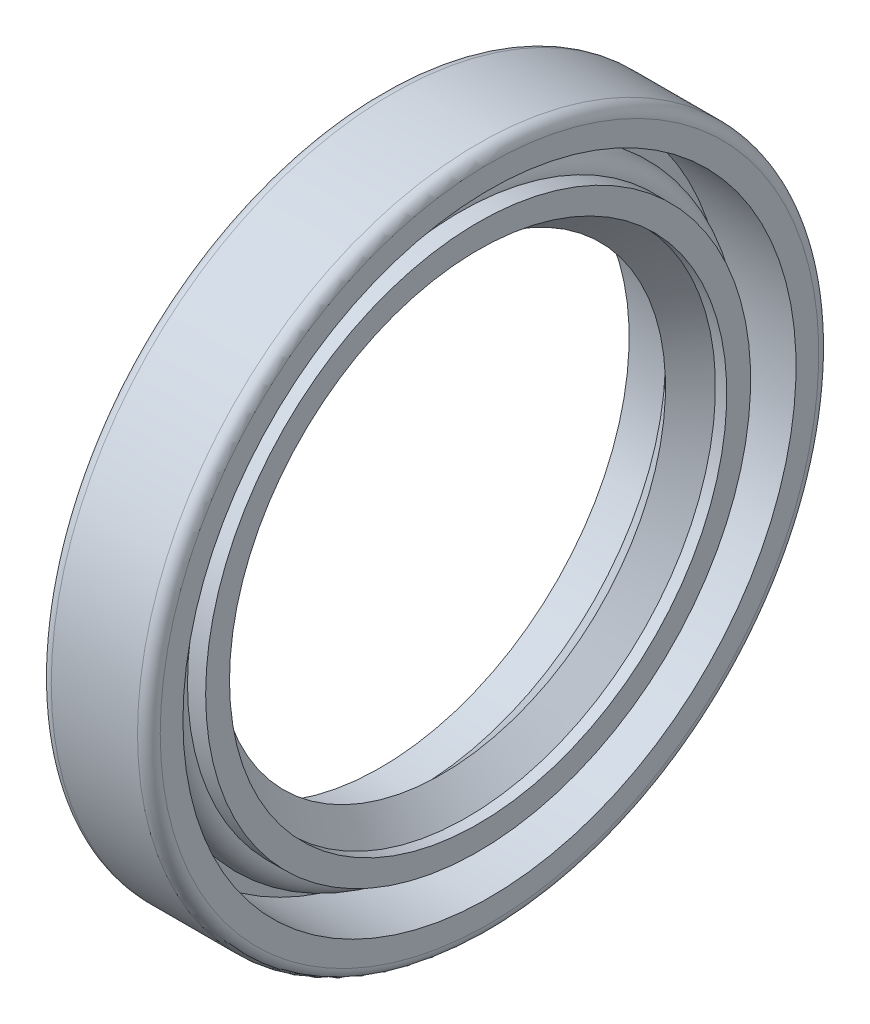
ISO-10303-21;
HEADER;
FILE_DESCRIPTION(('STEP AP214'),'2;1');
FILE_NAME('part.step','',(''),(''),'','','');
FILE_SCHEMA(('AUTOMOTIVE_DESIGN { 1 0 10303 214 1 1 1 1 }'));
ENDSEC;
DATA;
#1=APPLICATION_CONTEXT('core data for automotive mechanical design processes');
#2=APPLICATION_PROTOCOL_DEFINITION('international standard','automotive_design',2000,#1);
#3=PRODUCT_CONTEXT('',#1,'mechanical');
#4=PRODUCT('Part','Part','',(#3));
#5=PRODUCT_RELATED_PRODUCT_CATEGORY('part','',(#4));
#6=PRODUCT_DEFINITION_FORMATION('','',#4);
#7=PRODUCT_DEFINITION_CONTEXT('part definition',#1,'design');
#8=PRODUCT_DEFINITION('design','',#6,#7);
#9=PRODUCT_DEFINITION_SHAPE('','',#8);
#10=(LENGTH_UNIT() NAMED_UNIT(*) SI_UNIT(.MILLI.,.METRE.));
#11=(NAMED_UNIT(*) PLANE_ANGLE_UNIT() SI_UNIT($,.RADIAN.));
#12=(NAMED_UNIT(*) SI_UNIT($,.STERADIAN.) SOLID_ANGLE_UNIT());
#13=UNCERTAINTY_MEASURE_WITH_UNIT(LENGTH_MEASURE(1.E-05),#10,'distance_accuracy_value','');
#14=(GEOMETRIC_REPRESENTATION_CONTEXT(3) GLOBAL_UNCERTAINTY_ASSIGNED_CONTEXT((#13)) GLOBAL_UNIT_ASSIGNED_CONTEXT((#10,
#11,#12)) REPRESENTATION_CONTEXT('',''));
#15=CARTESIAN_POINT('',(0.,0.,0.));
#16=DIRECTION('',(0.,0.,1.));
#17=DIRECTION('',(1.,0.,0.));
#18=AXIS2_PLACEMENT_3D('',#15,#16,#17);
#19=CARTESIAN_POINT('',(0.,0.,0.));
#20=DIRECTION('',(-1.,0.,0.));
#21=DIRECTION('',(0.,0.,1.));
#22=AXIS2_PLACEMENT_3D('',#19,#20,#21);
#23=CYLINDRICAL_SURFACE('',#22,13.9065);
#24=CARTESIAN_POINT('',(2.032,0.,0.));
#25=DIRECTION('',(-1.,0.,0.));
#26=DIRECTION('',(0.,0.,1.));
#27=AXIS2_PLACEMENT_3D('',#24,#25,#26);
#28=CIRCLE('',#27,13.9065);
#29=CARTESIAN_POINT('',(2.032,0.,13.9065));
#30=VERTEX_POINT('',#29);
#31=EDGE_CURVE('E58',#30,#30,#28,.T.);
#32=ORIENTED_EDGE('',*,*,#31,.F.);
#33=EDGE_LOOP('',(#32));
#34=FACE_BOUND('',#33,.T.);
#35=CARTESIAN_POINT('',(0.,0.,0.));
#36=DIRECTION('',(-1.,0.,0.));
#37=DIRECTION('',(0.,0.,1.));
#38=AXIS2_PLACEMENT_3D('',#35,#36,#37);
#39=CIRCLE('',#38,13.9065);
#40=CARTESIAN_POINT('',(0.,0.,13.9065));
#41=VERTEX_POINT('',#40);
#42=EDGE_CURVE('E55',#41,#41,#39,.T.);
#43=ORIENTED_EDGE('',*,*,#42,.T.);
#44=EDGE_LOOP('',(#43));
#45=FACE_BOUND('',#44,.T.);
#46=ADVANCED_FACE('F35',(#34,#45),#23,.F.);
#47=CARTESIAN_POINT('',(2.032,0.,0.));
#48=DIRECTION('',(-1.,0.,0.));
#49=DIRECTION('',(0.,0.,1.));
#50=AXIS2_PLACEMENT_3D('',#47,#48,#49);
#51=CONICAL_SURFACE('',#50,13.9065,0.785398163397436);
#52=CARTESIAN_POINT('',(3.42900000000004,0.,0.));
#53=DIRECTION('',(-1.,0.,0.));
#54=DIRECTION('',(0.,0.,1.));
#55=AXIS2_PLACEMENT_3D('',#52,#53,#54);
#56=CIRCLE('',#55,12.5095);
#57=CARTESIAN_POINT('',(3.42900000000004,0.,12.5095));
#58=VERTEX_POINT('',#57);
#59=EDGE_CURVE('E61',#58,#58,#56,.T.);
#60=ORIENTED_EDGE('',*,*,#59,.F.);
#61=EDGE_LOOP('',(#60));
#62=FACE_BOUND('',#61,.T.);
#63=ORIENTED_EDGE('',*,*,#31,.T.);
#64=EDGE_LOOP('',(#63));
#65=FACE_BOUND('',#64,.T.);
#66=ADVANCED_FACE('F136',(#62,#65),#51,.F.);
#67=CARTESIAN_POINT('',(3.42900000000004,0.,0.));
#68=DIRECTION('',(1.,0.,0.));
#69=DIRECTION('',(0.,0.,-1.));
#70=AXIS2_PLACEMENT_3D('',#67,#68,#69);
#71=CONICAL_SURFACE('',#70,12.5095,0.785398163397461);
#72=CARTESIAN_POINT('',(4.826,0.,0.));
#73=DIRECTION('',(-1.,0.,0.));
#74=DIRECTION('',(0.,0.,1.));
#75=AXIS2_PLACEMENT_3D('',#72,#73,#74);
#76=CIRCLE('',#75,13.9065);
#77=CARTESIAN_POINT('',(4.826,0.,13.9065));
#78=VERTEX_POINT('',#77);
#79=EDGE_CURVE('E64',#78,#78,#76,.T.);
#80=ORIENTED_EDGE('',*,*,#79,.F.);
#81=EDGE_LOOP('',(#80));
#82=FACE_BOUND('',#81,.T.);
#83=ORIENTED_EDGE('',*,*,#59,.T.);
#84=EDGE_LOOP('',(#83));
#85=FACE_BOUND('',#84,.T.);
#86=ADVANCED_FACE('F130',(#82,#85),#71,.F.);
#87=CARTESIAN_POINT('',(0.,0.,0.));
#88=DIRECTION('',(-1.,0.,0.));
#89=DIRECTION('',(0.,0.,1.));
#90=AXIS2_PLACEMENT_3D('',#87,#88,#89);
#91=CYLINDRICAL_SURFACE('',#90,13.9065);
#92=CARTESIAN_POINT('',(5.461,0.,0.));
#93=DIRECTION('',(-1.,0.,0.));
#94=DIRECTION('',(0.,0.,1.));
#95=AXIS2_PLACEMENT_3D('',#92,#93,#94);
#96=CIRCLE('',#95,13.9065);
#97=CARTESIAN_POINT('',(5.461,0.,13.9065));
#98=VERTEX_POINT('',#97);
#99=EDGE_CURVE('E67',#98,#98,#96,.T.);
#100=ORIENTED_EDGE('',*,*,#99,.F.);
#101=EDGE_LOOP('',(#100));
#102=FACE_BOUND('',#101,.T.);
#103=ORIENTED_EDGE('',*,*,#79,.T.);
#104=EDGE_LOOP('',(#103));
#105=FACE_BOUND('',#104,.T.);
#106=ADVANCED_FACE('F124',(#102,#105),#91,.F.);
#107=CARTESIAN_POINT('',(5.461,15.24,0.));
#108=DIRECTION('',(-1.,0.,0.));
#109=DIRECTION('',(0.,0.,1.));
#110=AXIS2_PLACEMENT_3D('',#107,#108,#109);
#111=PLANE('',#110);
#112=CARTESIAN_POINT('',(5.461,0.,0.));
#113=DIRECTION('',(-1.,0.,0.));
#114=DIRECTION('',(0.,0.,1.));
#115=AXIS2_PLACEMENT_3D('',#112,#113,#114);
#116=CIRCLE('',#115,15.24);
#117=CARTESIAN_POINT('',(5.461,0.,15.24));
#118=VERTEX_POINT('',#117);
#119=EDGE_CURVE('E70',#118,#118,#116,.T.);
#120=ORIENTED_EDGE('',*,*,#119,.F.);
#121=EDGE_LOOP('',(#120));
#122=FACE_BOUND('',#121,.T.);
#123=ORIENTED_EDGE('',*,*,#99,.T.);
#124=EDGE_LOOP('',(#123));
#125=FACE_BOUND('',#124,.T.);
#126=ADVANCED_FACE('F118',(#122,#125),#111,.F.);
#127=CARTESIAN_POINT('',(0.,0.,0.));
#128=DIRECTION('',(-1.,0.,0.));
#129=DIRECTION('',(0.,0.,1.));
#130=AXIS2_PLACEMENT_3D('',#127,#128,#129);
#131=CYLINDRICAL_SURFACE('',#130,15.24);
#132=CARTESIAN_POINT('',(4.44500000000004,0.,0.));
#133=DIRECTION('',(-1.,0.,0.));
#134=DIRECTION('',(0.,0.,1.));
#135=AXIS2_PLACEMENT_3D('',#132,#133,#134);
#136=CIRCLE('',#135,15.24);
#137=CARTESIAN_POINT('',(4.44500000000004,0.,15.24));
#138=VERTEX_POINT('',#137);
#139=EDGE_CURVE('E73',#138,#138,#136,.T.);
#140=ORIENTED_EDGE('',*,*,#139,.F.);
#141=EDGE_LOOP('',(#140));
#142=FACE_BOUND('',#141,.T.);
#143=ORIENTED_EDGE('',*,*,#119,.T.);
#144=EDGE_LOOP('',(#143));
#145=FACE_BOUND('',#144,.T.);
#146=ADVANCED_FACE('F112',(#142,#145),#131,.T.);
#147=CARTESIAN_POINT('',(3.42900000000004,0.,0.));
#148=DIRECTION('',(-1.,0.,0.));
#149=DIRECTION('',(0.,0.,1.));
#150=AXIS2_PLACEMENT_3D('',#147,#148,#149);
#151=TOROIDAL_SURFACE('',#150,15.24,1.016);
#152=CARTESIAN_POINT('',(2.41300000000003,0.,0.));
#153=DIRECTION('',(-1.,0.,0.));
#154=DIRECTION('',(0.,0.,1.));
#155=AXIS2_PLACEMENT_3D('',#152,#153,#154);
#156=CIRCLE('',#155,15.24);
#157=CARTESIAN_POINT('',(2.41300000000003,0.,15.24));
#158=VERTEX_POINT('',#157);
#159=EDGE_CURVE('E76',#158,#158,#156,.T.);
#160=ORIENTED_EDGE('',*,*,#159,.F.);
#161=EDGE_LOOP('',(#160));
#162=FACE_BOUND('',#161,.T.);
#163=ORIENTED_EDGE('',*,*,#139,.T.);
#164=EDGE_LOOP('',(#163));
#165=FACE_BOUND('',#164,.T.);
#166=ADVANCED_FACE('F106',(#162,#165),#151,.T.);
#167=CARTESIAN_POINT('',(0.,0.,0.));
#168=DIRECTION('',(-1.,0.,0.));
#169=DIRECTION('',(0.,0.,1.));
#170=AXIS2_PLACEMENT_3D('',#167,#168,#169);
#171=CYLINDRICAL_SURFACE('',#170,15.24);
#172=CARTESIAN_POINT('',(2.032,0.,0.));
#173=DIRECTION('',(-1.,0.,0.));
#174=DIRECTION('',(0.,0.,1.));
#175=AXIS2_PLACEMENT_3D('',#172,#173,#174);
#176=CIRCLE('',#175,15.24);
#177=CARTESIAN_POINT('',(2.032,0.,15.24));
#178=VERTEX_POINT('',#177);
#179=EDGE_CURVE('E79',#178,#178,#176,.T.);
#180=ORIENTED_EDGE('',*,*,#179,.F.);
#181=EDGE_LOOP('',(#180));
#182=FACE_BOUND('',#181,.T.);
#183=ORIENTED_EDGE('',*,*,#159,.T.);
#184=EDGE_LOOP('',(#183));
#185=FACE_BOUND('',#184,.T.);
#186=ADVANCED_FACE('F100',(#182,#185),#171,.T.);
#187=CARTESIAN_POINT('',(2.032,17.145,0.));
#188=DIRECTION('',(-1.,0.,0.));
#189=DIRECTION('',(0.,0.,1.));
#190=AXIS2_PLACEMENT_3D('',#187,#188,#189);
#191=PLANE('',#190);
#192=CARTESIAN_POINT('',(2.032,0.,0.));
#193=DIRECTION('',(-1.,0.,0.));
#194=DIRECTION('',(0.,0.,1.));
#195=AXIS2_PLACEMENT_3D('',#192,#193,#194);
#196=CIRCLE('',#195,17.145);
#197=CARTESIAN_POINT('',(2.032,0.,17.145));
#198=VERTEX_POINT('',#197);
#199=EDGE_CURVE('E82',#198,#198,#196,.T.);
#200=ORIENTED_EDGE('',*,*,#199,.F.);
#201=EDGE_LOOP('',(#200));
#202=FACE_BOUND('',#201,.T.);
#203=ORIENTED_EDGE('',*,*,#179,.T.);
#204=EDGE_LOOP('',(#203));
#205=FACE_BOUND('',#204,.T.);
#206=ADVANCED_FACE('F94',(#202,#205),#191,.F.);
#207=CARTESIAN_POINT('',(0.,0.,0.));
#208=DIRECTION('',(-1.,0.,0.));
#209=DIRECTION('',(0.,0.,1.));
#210=AXIS2_PLACEMENT_3D('',#207,#208,#209);
#211=CYLINDRICAL_SURFACE('',#210,17.145);
#212=CARTESIAN_POINT('',(6.096,0.,0.));
#213=DIRECTION('',(-1.,0.,0.));
#214=DIRECTION('',(0.,0.,1.));
#215=AXIS2_PLACEMENT_3D('',#212,#213,#214);
#216=CIRCLE('',#215,17.145);
#217=CARTESIAN_POINT('',(6.096,0.,17.145));
#218=VERTEX_POINT('',#217);
#219=EDGE_CURVE('E85',#218,#218,#216,.T.);
#220=ORIENTED_EDGE('',*,*,#219,.F.);
#221=EDGE_LOOP('',(#220));
#222=FACE_BOUND('',#221,.T.);
#223=ORIENTED_EDGE('',*,*,#199,.T.);
#224=EDGE_LOOP('',(#223));
#225=FACE_BOUND('',#224,.T.);
#226=ADVANCED_FACE('F91',(#222,#225),#211,.F.);
#227=CARTESIAN_POINT('',(6.096,17.145,0.));
#228=DIRECTION('',(-1.,0.,0.));
#229=DIRECTION('',(0.,0.,1.));
#230=AXIS2_PLACEMENT_3D('',#227,#228,#229);
#231=PLANE('',#230);
#232=CARTESIAN_POINT('',(6.096,0.,0.));
#233=DIRECTION('',(-1.,0.,0.));
#234=DIRECTION('',(0.,0.,1.));
#235=AXIS2_PLACEMENT_3D('',#232,#233,#234);
#236=CIRCLE('',#235,18.415);
#237=CARTESIAN_POINT('',(6.096,0.,18.415));
#238=VERTEX_POINT('',#237);
#239=EDGE_CURVE('E10',#238,#238,#236,.F.);
#240=ORIENTED_EDGE('',*,*,#239,.T.);
#241=EDGE_LOOP('',(#240));
#242=FACE_BOUND('',#241,.T.);
#243=ORIENTED_EDGE('',*,*,#219,.T.);
#244=EDGE_LOOP('',(#243));
#245=FACE_BOUND('',#244,.T.);
#246=ADVANCED_FACE('F89',(#242,#245),#231,.F.);
#247=CARTESIAN_POINT('',(0.,0.,0.));
#248=DIRECTION('',(-1.,0.,0.));
#249=DIRECTION('',(0.,0.,1.));
#250=AXIS2_PLACEMENT_3D('',#247,#248,#249);
#251=CYLINDRICAL_SURFACE('',#250,19.05);
#252=CARTESIAN_POINT('',(0.635,0.,0.));
#253=DIRECTION('',(1.,0.,0.));
#254=DIRECTION('',(0.,0.,-1.));
#255=AXIS2_PLACEMENT_3D('',#252,#253,#254);
#256=CIRCLE('',#255,19.05);
#257=CARTESIAN_POINT('',(0.635,0.,-19.05));
#258=VERTEX_POINT('',#257);
#259=EDGE_CURVE('E42',#258,#258,#256,.T.);
#260=ORIENTED_EDGE('',*,*,#259,.T.);
#261=EDGE_LOOP('',(#260));
#262=FACE_BOUND('',#261,.T.);
#263=CARTESIAN_POINT('',(5.461,0.,0.));
#264=DIRECTION('',(-1.,0.,0.));
#265=DIRECTION('',(0.,0.,1.));
#266=AXIS2_PLACEMENT_3D('',#263,#264,#265);
#267=CIRCLE('',#266,19.05);
#268=CARTESIAN_POINT('',(5.461,0.,19.05));
#269=VERTEX_POINT('',#268);
#270=EDGE_CURVE('E46',#269,#269,#267,.T.);
#271=ORIENTED_EDGE('',*,*,#270,.T.);
#272=EDGE_LOOP('',(#271));
#273=FACE_BOUND('',#272,.T.);
#274=ADVANCED_FACE('F153',(#262,#273),#251,.T.);
#275=CARTESIAN_POINT('',(0.,17.145,0.));
#276=DIRECTION('',(1.,0.,0.));
#277=DIRECTION('',(0.,0.,-1.));
#278=AXIS2_PLACEMENT_3D('',#275,#276,#277);
#279=PLANE('',#278);
#280=CARTESIAN_POINT('',(0.,0.,0.));
#281=DIRECTION('',(1.,0.,0.));
#282=DIRECTION('',(0.,0.,-1.));
#283=AXIS2_PLACEMENT_3D('',#280,#281,#282);
#284=CIRCLE('',#283,18.415);
#285=CARTESIAN_POINT('',(0.,0.,-18.415));
#286=VERTEX_POINT('',#285);
#287=EDGE_CURVE('E50',#286,#286,#284,.F.);
#288=ORIENTED_EDGE('',*,*,#287,.T.);
#289=EDGE_LOOP('',(#288));
#290=FACE_BOUND('',#289,.T.);
#291=ORIENTED_EDGE('',*,*,#42,.F.);
#292=EDGE_LOOP('',(#291));
#293=FACE_BOUND('',#292,.T.);
#294=ADVANCED_FACE('F150',(#290,#293),#279,.F.);
#295=CARTESIAN_POINT('',(0.635,0.,0.));
#296=DIRECTION('',(1.,0.,0.));
#297=DIRECTION('',(0.,0.,-1.));
#298=AXIS2_PLACEMENT_3D('',#295,#296,#297);
#299=TOROIDAL_SURFACE('',#298,18.415,0.635);
#300=ORIENTED_EDGE('',*,*,#259,.F.);
#301=EDGE_LOOP('',(#300));
#302=FACE_BOUND('',#301,.T.);
#303=ORIENTED_EDGE('',*,*,#287,.F.);
#304=EDGE_LOOP('',(#303));
#305=FACE_BOUND('',#304,.T.);
#306=ADVANCED_FACE('F152',(#302,#305),#299,.T.);
#307=CARTESIAN_POINT('',(5.461,0.,0.));
#308=DIRECTION('',(-1.,0.,0.));
#309=DIRECTION('',(0.,0.,1.));
#310=AXIS2_PLACEMENT_3D('',#307,#308,#309);
#311=TOROIDAL_SURFACE('',#310,18.415,0.635);
#312=ORIENTED_EDGE('',*,*,#239,.F.);
#313=EDGE_LOOP('',(#312));
#314=FACE_BOUND('',#313,.T.);
#315=ORIENTED_EDGE('',*,*,#270,.F.);
#316=EDGE_LOOP('',(#315));
#317=FACE_BOUND('',#316,.T.);
#318=ADVANCED_FACE('F37',(#314,#317),#311,.T.);
#319=CLOSED_SHELL('',(#46,#66,#86,#106,#126,#146,#166,#186,#206,#226,#246,#274,#294,#306,#318));
#320=MANIFOLD_SOLID_BREP('B2',#319);
#321=ADVANCED_BREP_SHAPE_REPRESENTATION('',(#18,#320),#14);
#322=SHAPE_DEFINITION_REPRESENTATION(#9,#321);
ENDSEC;
END-ISO-10303-21;
